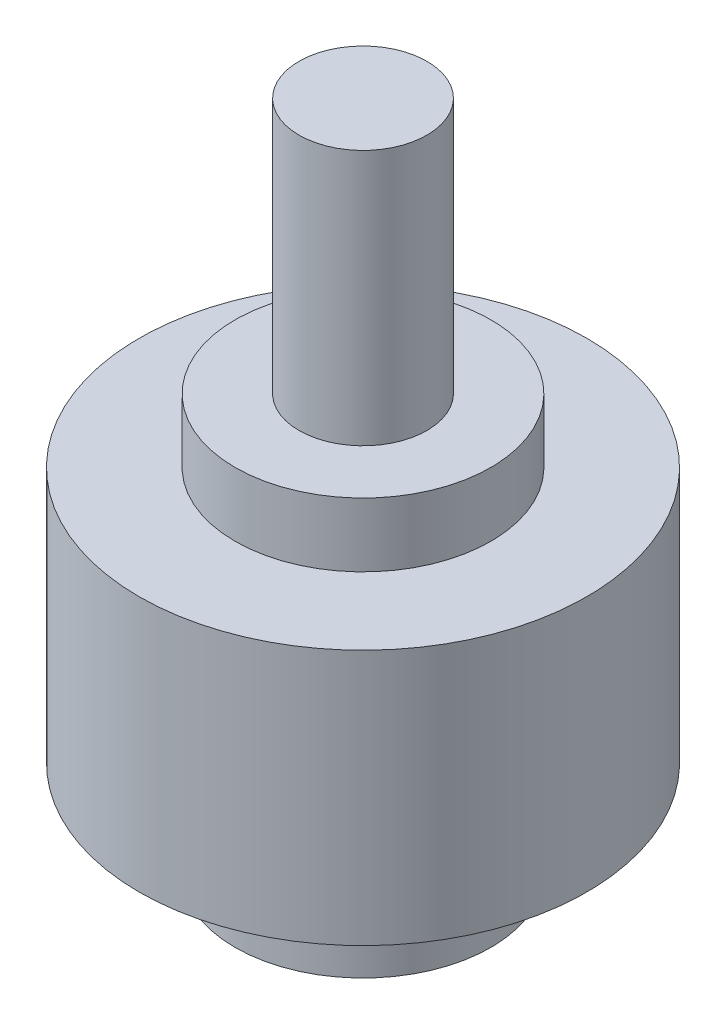
ISO-10303-21;
HEADER;
FILE_DESCRIPTION(('STEP AP214'),'2;1');
FILE_NAME('part.step','',(''),(''),'','','');
FILE_SCHEMA(('AUTOMOTIVE_DESIGN { 1 0 10303 214 1 1 1 1 }'));
ENDSEC;
DATA;
#1=APPLICATION_CONTEXT('core data for automotive mechanical design processes');
#2=APPLICATION_PROTOCOL_DEFINITION('international standard','automotive_design',2000,#1);
#3=PRODUCT_CONTEXT('',#1,'mechanical');
#4=PRODUCT('Part','Part','',(#3));
#5=PRODUCT_RELATED_PRODUCT_CATEGORY('part','',(#4));
#6=PRODUCT_DEFINITION_FORMATION('','',#4);
#7=PRODUCT_DEFINITION_CONTEXT('part definition',#1,'design');
#8=PRODUCT_DEFINITION('design','',#6,#7);
#9=PRODUCT_DEFINITION_SHAPE('','',#8);
#10=(LENGTH_UNIT() NAMED_UNIT(*) SI_UNIT(.MILLI.,.METRE.));
#11=(NAMED_UNIT(*) PLANE_ANGLE_UNIT() SI_UNIT($,.RADIAN.));
#12=(NAMED_UNIT(*) SI_UNIT($,.STERADIAN.) SOLID_ANGLE_UNIT());
#13=UNCERTAINTY_MEASURE_WITH_UNIT(LENGTH_MEASURE(1.E-05),#10,'distance_accuracy_value','');
#14=(GEOMETRIC_REPRESENTATION_CONTEXT(3) GLOBAL_UNCERTAINTY_ASSIGNED_CONTEXT((#13)) GLOBAL_UNIT_ASSIGNED_CONTEXT((#10,
#11,#12)) REPRESENTATION_CONTEXT('',''));
#15=CARTESIAN_POINT('',(0.,0.,0.));
#16=DIRECTION('',(0.,0.,1.));
#17=DIRECTION('',(1.,0.,0.));
#18=AXIS2_PLACEMENT_3D('',#15,#16,#17);
#19=CARTESIAN_POINT('',(12.7,133.35,0.));
#20=DIRECTION('',(0.,-1.,0.));
#21=DIRECTION('',(0.,0.,-1.));
#22=AXIS2_PLACEMENT_3D('',#19,#20,#21);
#23=PLANE('',#22);
#24=CARTESIAN_POINT('',(0.,133.35,0.));
#25=DIRECTION('',(0.,1.,0.));
#26=DIRECTION('',(0.,0.,1.));
#27=AXIS2_PLACEMENT_3D('',#24,#25,#26);
#28=CIRCLE('',#27,12.7);
#29=CARTESIAN_POINT('',(0.,133.35,12.7));
#30=VERTEX_POINT('',#29);
#31=EDGE_CURVE('E10',#30,#30,#28,.T.);
#32=ORIENTED_EDGE('',*,*,#31,.T.);
#33=EDGE_LOOP('',(#32));
#34=FACE_BOUND('',#33,.T.);
#35=ADVANCED_FACE('F32',(#34),#23,.F.);
#36=CARTESIAN_POINT('',(0.,0.,0.));
#37=DIRECTION('',(0.,1.,0.));
#38=DIRECTION('',(0.,0.,1.));
#39=AXIS2_PLACEMENT_3D('',#36,#37,#38);
#40=CYLINDRICAL_SURFACE('',#39,12.7);
#41=ORIENTED_EDGE('',*,*,#31,.F.);
#42=EDGE_LOOP('',(#41));
#43=FACE_BOUND('',#42,.T.);
#44=CARTESIAN_POINT('',(0.,82.55,0.));
#45=DIRECTION('',(0.,1.,0.));
#46=DIRECTION('',(0.,0.,1.));
#47=AXIS2_PLACEMENT_3D('',#44,#45,#46);
#48=CIRCLE('',#47,12.7);
#49=CARTESIAN_POINT('',(0.,82.55,12.7));
#50=VERTEX_POINT('',#49);
#51=EDGE_CURVE('E38',#50,#50,#48,.T.);
#52=ORIENTED_EDGE('',*,*,#51,.T.);
#53=EDGE_LOOP('',(#52));
#54=FACE_BOUND('',#53,.T.);
#55=ADVANCED_FACE('F97',(#43,#54),#40,.T.);
#56=CARTESIAN_POINT('',(25.4,82.55,0.));
#57=DIRECTION('',(0.,-1.,0.));
#58=DIRECTION('',(0.,0.,-1.));
#59=AXIS2_PLACEMENT_3D('',#56,#57,#58);
#60=PLANE('',#59);
#61=ORIENTED_EDGE('',*,*,#51,.F.);
#62=EDGE_LOOP('',(#61));
#63=FACE_BOUND('',#62,.T.);
#64=CARTESIAN_POINT('',(0.,82.55,0.));
#65=DIRECTION('',(0.,1.,0.));
#66=DIRECTION('',(0.,0.,1.));
#67=AXIS2_PLACEMENT_3D('',#64,#65,#66);
#68=CIRCLE('',#67,25.4);
#69=CARTESIAN_POINT('',(0.,82.55,25.4));
#70=VERTEX_POINT('',#69);
#71=EDGE_CURVE('E42',#70,#70,#68,.T.);
#72=ORIENTED_EDGE('',*,*,#71,.T.);
#73=EDGE_LOOP('',(#72));
#74=FACE_BOUND('',#73,.T.);
#75=ADVANCED_FACE('F101',(#63,#74),#60,.F.);
#76=CARTESIAN_POINT('',(0.,0.,0.));
#77=DIRECTION('',(0.,1.,0.));
#78=DIRECTION('',(0.,0.,1.));
#79=AXIS2_PLACEMENT_3D('',#76,#77,#78);
#80=CYLINDRICAL_SURFACE('',#79,25.4);
#81=ORIENTED_EDGE('',*,*,#71,.F.);
#82=EDGE_LOOP('',(#81));
#83=FACE_BOUND('',#82,.T.);
#84=CARTESIAN_POINT('',(0.,69.85,0.));
#85=DIRECTION('',(0.,1.,0.));
#86=DIRECTION('',(0.,0.,1.));
#87=AXIS2_PLACEMENT_3D('',#84,#85,#86);
#88=CIRCLE('',#87,25.4);
#89=CARTESIAN_POINT('',(0.,69.85,25.4));
#90=VERTEX_POINT('',#89);
#91=EDGE_CURVE('E46',#90,#90,#88,.T.);
#92=ORIENTED_EDGE('',*,*,#91,.T.);
#93=EDGE_LOOP('',(#92));
#94=FACE_BOUND('',#93,.T.);
#95=ADVANCED_FACE('F106',(#83,#94),#80,.T.);
#96=CARTESIAN_POINT('',(44.45,69.85,0.));
#97=DIRECTION('',(0.,-1.,0.));
#98=DIRECTION('',(0.,0.,-1.));
#99=AXIS2_PLACEMENT_3D('',#96,#97,#98);
#100=PLANE('',#99);
#101=ORIENTED_EDGE('',*,*,#91,.F.);
#102=EDGE_LOOP('',(#101));
#103=FACE_BOUND('',#102,.T.);
#104=CARTESIAN_POINT('',(0.,69.85,0.));
#105=DIRECTION('',(0.,1.,0.));
#106=DIRECTION('',(0.,0.,1.));
#107=AXIS2_PLACEMENT_3D('',#104,#105,#106);
#108=CIRCLE('',#107,44.45);
#109=CARTESIAN_POINT('',(0.,69.85,44.45));
#110=VERTEX_POINT('',#109);
#111=EDGE_CURVE('E51',#110,#110,#108,.T.);
#112=ORIENTED_EDGE('',*,*,#111,.T.);
#113=EDGE_LOOP('',(#112));
#114=FACE_BOUND('',#113,.T.);
#115=ADVANCED_FACE('F112',(#103,#114),#100,.F.);
#116=CARTESIAN_POINT('',(0.,0.,0.));
#117=DIRECTION('',(0.,1.,0.));
#118=DIRECTION('',(0.,0.,1.));
#119=AXIS2_PLACEMENT_3D('',#116,#117,#118);
#120=CYLINDRICAL_SURFACE('',#119,44.45);
#121=ORIENTED_EDGE('',*,*,#111,.F.);
#122=EDGE_LOOP('',(#121));
#123=FACE_BOUND('',#122,.T.);
#124=CARTESIAN_POINT('',(0.,19.05,0.));
#125=DIRECTION('',(0.,1.,0.));
#126=DIRECTION('',(0.,0.,1.));
#127=AXIS2_PLACEMENT_3D('',#124,#125,#126);
#128=CIRCLE('',#127,44.45);
#129=CARTESIAN_POINT('',(0.,19.05,44.45));
#130=VERTEX_POINT('',#129);
#131=EDGE_CURVE('E54',#130,#130,#128,.T.);
#132=ORIENTED_EDGE('',*,*,#131,.T.);
#133=EDGE_LOOP('',(#132));
#134=FACE_BOUND('',#133,.T.);
#135=ADVANCED_FACE('F92',(#123,#134),#120,.T.);
#136=CARTESIAN_POINT('',(25.4,19.05,0.));
#137=DIRECTION('',(0.,1.,0.));
#138=DIRECTION('',(0.,0.,1.));
#139=AXIS2_PLACEMENT_3D('',#136,#137,#138);
#140=PLANE('',#139);
#141=ORIENTED_EDGE('',*,*,#131,.F.);
#142=EDGE_LOOP('',(#141));
#143=FACE_BOUND('',#142,.T.);
#144=CARTESIAN_POINT('',(0.,19.05,0.));
#145=DIRECTION('',(0.,1.,0.));
#146=DIRECTION('',(0.,0.,1.));
#147=AXIS2_PLACEMENT_3D('',#144,#145,#146);
#148=CIRCLE('',#147,25.4);
#149=CARTESIAN_POINT('',(0.,19.05,25.4));
#150=VERTEX_POINT('',#149);
#151=EDGE_CURVE('E57',#150,#150,#148,.T.);
#152=ORIENTED_EDGE('',*,*,#151,.T.);
#153=EDGE_LOOP('',(#152));
#154=FACE_BOUND('',#153,.T.);
#155=ADVANCED_FACE('F86',(#143,#154),#140,.F.);
#156=CARTESIAN_POINT('',(0.,0.,0.));
#157=DIRECTION('',(0.,1.,0.));
#158=DIRECTION('',(0.,0.,1.));
#159=AXIS2_PLACEMENT_3D('',#156,#157,#158);
#160=CYLINDRICAL_SURFACE('',#159,25.4);
#161=ORIENTED_EDGE('',*,*,#151,.F.);
#162=EDGE_LOOP('',(#161));
#163=FACE_BOUND('',#162,.T.);
#164=CARTESIAN_POINT('',(0.,0.,0.));
#165=DIRECTION('',(0.,1.,0.));
#166=DIRECTION('',(0.,0.,1.));
#167=AXIS2_PLACEMENT_3D('',#164,#165,#166);
#168=CIRCLE('',#167,25.4);
#169=CARTESIAN_POINT('',(0.,0.,25.4));
#170=VERTEX_POINT('',#169);
#171=EDGE_CURVE('E60',#170,#170,#168,.T.);
#172=ORIENTED_EDGE('',*,*,#171,.T.);
#173=EDGE_LOOP('',(#172));
#174=FACE_BOUND('',#173,.T.);
#175=ADVANCED_FACE('F81',(#163,#174),#160,.T.);
#176=CARTESIAN_POINT('',(0.,0.,0.));
#177=DIRECTION('',(0.,1.,0.));
#178=DIRECTION('',(0.,0.,1.));
#179=AXIS2_PLACEMENT_3D('',#176,#177,#178);
#180=PLANE('',#179);
#181=CARTESIAN_POINT('',(0.,0.,0.));
#182=DIRECTION('',(0.,-1.,0.));
#183=DIRECTION('',(0.,0.,-1.));
#184=AXIS2_PLACEMENT_3D('',#181,#182,#183);
#185=CIRCLE('',#184,12.7);
#186=CARTESIAN_POINT('',(0.,0.,-12.7));
#187=VERTEX_POINT('',#186);
#188=EDGE_CURVE('E64',#187,#187,#185,.T.);
#189=ORIENTED_EDGE('',*,*,#188,.F.);
#190=EDGE_LOOP('',(#189));
#191=FACE_BOUND('',#190,.T.);
#192=ORIENTED_EDGE('',*,*,#171,.F.);
#193=EDGE_LOOP('',(#192));
#194=FACE_BOUND('',#193,.T.);
#195=ADVANCED_FACE('F75',(#191,#194),#180,.F.);
#196=CARTESIAN_POINT('',(0.,50.8,0.));
#197=DIRECTION('',(0.,-1.,0.));
#198=DIRECTION('',(0.,0.,-1.));
#199=AXIS2_PLACEMENT_3D('',#196,#197,#198);
#200=CYLINDRICAL_SURFACE('',#199,12.7);
#201=CARTESIAN_POINT('',(0.,50.8,0.));
#202=DIRECTION('',(0.,-1.,0.));
#203=DIRECTION('',(0.,0.,-1.));
#204=AXIS2_PLACEMENT_3D('',#201,#202,#203);
#205=CIRCLE('',#204,12.7);
#206=CARTESIAN_POINT('',(0.,50.8,-12.7));
#207=VERTEX_POINT('',#206);
#208=EDGE_CURVE('E63',#207,#207,#205,.T.);
#209=ORIENTED_EDGE('',*,*,#208,.F.);
#210=EDGE_LOOP('',(#209));
#211=FACE_BOUND('',#210,.T.);
#212=ORIENTED_EDGE('',*,*,#188,.T.);
#213=EDGE_LOOP('',(#212));
#214=FACE_BOUND('',#213,.T.);
#215=ADVANCED_FACE('F72',(#211,#214),#200,.F.);
#216=CARTESIAN_POINT('',(0.,50.8,0.));
#217=DIRECTION('',(0.,-1.,0.));
#218=DIRECTION('',(0.,0.,-1.));
#219=AXIS2_PLACEMENT_3D('',#216,#217,#218);
#220=PLANE('',#219);
#221=ORIENTED_EDGE('',*,*,#208,.T.);
#222=EDGE_LOOP('',(#221));
#223=FACE_BOUND('',#222,.T.);
#224=ADVANCED_FACE('F70',(#223),#220,.T.);
#225=CLOSED_SHELL('',(#35,#55,#75,#95,#115,#135,#155,#175,#195,#215,#224));
#226=MANIFOLD_SOLID_BREP('B2',#225);
#227=ADVANCED_BREP_SHAPE_REPRESENTATION('',(#18,#226),#14);
#228=SHAPE_DEFINITION_REPRESENTATION(#9,#227);
ENDSEC;
END-ISO-10303-21;
